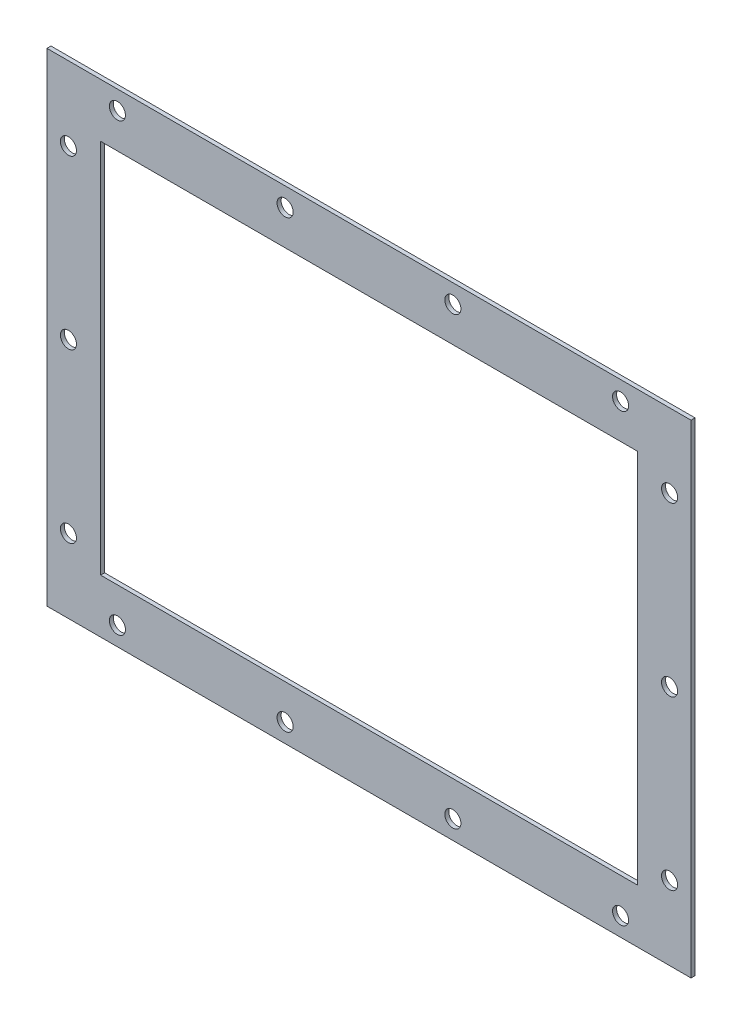
ISO-10303-21;
HEADER;
FILE_DESCRIPTION(('STEP AP214'),'2;1');
FILE_NAME('part.step','',(''),(''),'','','');
FILE_SCHEMA(('AUTOMOTIVE_DESIGN { 1 0 10303 214 1 1 1 1 }'));
ENDSEC;
DATA;
#1=APPLICATION_CONTEXT('core data for automotive mechanical design processes');
#2=APPLICATION_PROTOCOL_DEFINITION('international standard','automotive_design',2000,#1);
#3=PRODUCT_CONTEXT('',#1,'mechanical');
#4=PRODUCT('Part','Part','',(#3));
#5=PRODUCT_RELATED_PRODUCT_CATEGORY('part','',(#4));
#6=PRODUCT_DEFINITION_FORMATION('','',#4);
#7=PRODUCT_DEFINITION_CONTEXT('part definition',#1,'design');
#8=PRODUCT_DEFINITION('design','',#6,#7);
#9=PRODUCT_DEFINITION_SHAPE('','',#8);
#10=(LENGTH_UNIT() NAMED_UNIT(*) SI_UNIT(.MILLI.,.METRE.));
#11=(NAMED_UNIT(*) PLANE_ANGLE_UNIT() SI_UNIT($,.RADIAN.));
#12=(NAMED_UNIT(*) SI_UNIT($,.STERADIAN.) SOLID_ANGLE_UNIT());
#13=UNCERTAINTY_MEASURE_WITH_UNIT(LENGTH_MEASURE(1.E-05),#10,'distance_accuracy_value','');
#14=(GEOMETRIC_REPRESENTATION_CONTEXT(3) GLOBAL_UNCERTAINTY_ASSIGNED_CONTEXT((#13)) GLOBAL_UNIT_ASSIGNED_CONTEXT((#10,
#11,#12)) REPRESENTATION_CONTEXT('',''));
#15=CARTESIAN_POINT('',(0.,0.,0.));
#16=DIRECTION('',(0.,0.,1.));
#17=DIRECTION('',(1.,0.,0.));
#18=AXIS2_PLACEMENT_3D('',#15,#16,#17);
#19=CARTESIAN_POINT('',(-0.00118137540872088,140.003031099028,-299.996268284591));
#20=DIRECTION('',(0.,-1.,0.));
#21=DIRECTION('',(-1.,0.,0.));
#22=AXIS2_PLACEMENT_3D('',#19,#20,#21);
#23=PLANE('',#22);
#24=DIRECTION('',(0.,0.,-1.));
#25=VECTOR('',#24,1.);
#26=CARTESIAN_POINT('',(199.998818624592,140.003031099028,-299.996268284593));
#27=LINE('',#26,#25);
#28=CARTESIAN_POINT('',(199.998818624592,140.003031099028,-296.996268284593));
#29=VERTEX_POINT('',#28);
#30=CARTESIAN_POINT('',(199.998818624592,140.003031099028,-299.996268284593));
#31=VERTEX_POINT('',#30);
#32=EDGE_CURVE('E11',#29,#31,#27,.T.);
#33=ORIENTED_EDGE('',*,*,#32,.F.);
#34=DIRECTION('',(-1.,0.,0.));
#35=VECTOR('',#34,1.);
#36=CARTESIAN_POINT('',(-0.00118137540869924,140.003031099028,-296.996268284591));
#37=LINE('',#36,#35);
#38=CARTESIAN_POINT('',(-200.001181375408,140.003031099029,-296.99626828459));
#39=VERTEX_POINT('',#38);
#40=EDGE_CURVE('E104',#29,#39,#37,.T.);
#41=ORIENTED_EDGE('',*,*,#40,.T.);
#42=DIRECTION('',(0.,0.,-1.));
#43=VECTOR('',#42,1.);
#44=CARTESIAN_POINT('',(-200.001181375408,140.003031099029,-299.996268284591));
#45=LINE('',#44,#43);
#46=CARTESIAN_POINT('',(-200.001181375408,140.003031099029,-299.996268284591));
#47=VERTEX_POINT('',#46);
#48=EDGE_CURVE('E47',#39,#47,#45,.T.);
#49=ORIENTED_EDGE('',*,*,#48,.T.);
#50=DIRECTION('',(-1.,0.,0.));
#51=VECTOR('',#50,1.);
#52=CARTESIAN_POINT('',(-0.00118137540872088,140.003031099028,-299.996268284591));
#53=LINE('',#52,#51);
#54=EDGE_CURVE('E132',#31,#47,#53,.T.);
#55=ORIENTED_EDGE('',*,*,#54,.F.);
#56=EDGE_LOOP('',(#33,#41,#49,#55));
#57=FACE_BOUND('',#56,.T.);
#58=ADVANCED_FACE('F37',(#57),#23,.T.);
#59=CARTESIAN_POINT('',(-200.001181375408,0.00303109902907717,-299.99626828459));
#60=DIRECTION('',(-1.,0.,0.));
#61=DIRECTION('',(0.,1.,0.));
#62=AXIS2_PLACEMENT_3D('',#59,#60,#61);
#63=PLANE('',#62);
#64=ORIENTED_EDGE('',*,*,#48,.F.);
#65=DIRECTION('',(0.,1.,0.));
#66=VECTOR('',#65,1.);
#67=CARTESIAN_POINT('',(-200.001181375408,0.00303109902907974,-296.99626828459));
#68=LINE('',#67,#66);
#69=CARTESIAN_POINT('',(-200.001181375409,-139.99696890097,-296.996268284589));
#70=VERTEX_POINT('',#69);
#71=EDGE_CURVE('E114',#39,#70,#68,.F.);
#72=ORIENTED_EDGE('',*,*,#71,.T.);
#73=DIRECTION('',(0.,0.,-1.));
#74=VECTOR('',#73,1.);
#75=CARTESIAN_POINT('',(-200.00118137541,-139.99696890097,-299.99626828459));
#76=LINE('',#75,#74);
#77=CARTESIAN_POINT('',(-200.00118137541,-139.99696890097,-299.99626828459));
#78=VERTEX_POINT('',#77);
#79=EDGE_CURVE('E55',#70,#78,#76,.T.);
#80=ORIENTED_EDGE('',*,*,#79,.T.);
#81=DIRECTION('',(0.,1.,0.));
#82=VECTOR('',#81,1.);
#83=CARTESIAN_POINT('',(-200.001181375408,0.00303109902907717,-299.99626828459));
#84=LINE('',#83,#82);
#85=EDGE_CURVE('E129',#47,#78,#84,.F.);
#86=ORIENTED_EDGE('',*,*,#85,.F.);
#87=EDGE_LOOP('',(#64,#72,#80,#86));
#88=FACE_BOUND('',#87,.T.);
#89=ADVANCED_FACE('F137',(#88),#63,.F.);
#90=CARTESIAN_POINT('',(-0.00118137540872088,-139.99696890097,-299.996268284591));
#91=DIRECTION('',(0.,-1.,0.));
#92=DIRECTION('',(-1.,0.,0.));
#93=AXIS2_PLACEMENT_3D('',#90,#91,#92);
#94=PLANE('',#93);
#95=ORIENTED_EDGE('',*,*,#79,.F.);
#96=DIRECTION('',(-1.,0.,0.));
#97=VECTOR('',#96,1.);
#98=CARTESIAN_POINT('',(-0.00118137540869924,-139.99696890097,-296.996268284591));
#99=LINE('',#98,#97);
#100=CARTESIAN_POINT('',(199.99881862459,-139.996968900972,-296.996268284592));
#101=VERTEX_POINT('',#100);
#102=EDGE_CURVE('E103',#70,#101,#99,.F.);
#103=ORIENTED_EDGE('',*,*,#102,.T.);
#104=DIRECTION('',(0.,0.,-1.));
#105=VECTOR('',#104,1.);
#106=CARTESIAN_POINT('',(199.99881862459,-139.996968900972,-299.996268284591));
#107=LINE('',#106,#105);
#108=CARTESIAN_POINT('',(199.99881862459,-139.996968900972,-299.996268284591));
#109=VERTEX_POINT('',#108);
#110=EDGE_CURVE('E41',#101,#109,#107,.T.);
#111=ORIENTED_EDGE('',*,*,#110,.T.);
#112=DIRECTION('',(-1.,0.,0.));
#113=VECTOR('',#112,1.);
#114=CARTESIAN_POINT('',(-0.00118137540872088,-139.99696890097,-299.996268284591));
#115=LINE('',#114,#113);
#116=EDGE_CURVE('E305',#78,#109,#115,.F.);
#117=ORIENTED_EDGE('',*,*,#116,.F.);
#118=EDGE_LOOP('',(#95,#103,#111,#117));
#119=FACE_BOUND('',#118,.T.);
#120=ADVANCED_FACE('F106',(#119),#94,.F.);
#121=CARTESIAN_POINT('',(-0.00118137540872088,-179.996968900972,-299.996268284591));
#122=DIRECTION('',(0.,-1.,0.));
#123=DIRECTION('',(-1.,0.,0.));
#124=AXIS2_PLACEMENT_3D('',#121,#122,#123);
#125=PLANE('',#124);
#126=DIRECTION('',(0.,0.,-1.));
#127=VECTOR('',#126,1.);
#128=CARTESIAN_POINT('',(239.99881862459,-179.996968900972,-299.996268284591));
#129=LINE('',#128,#127);
#130=CARTESIAN_POINT('',(239.998818624591,-179.996968900972,-296.996268284593));
#131=VERTEX_POINT('',#130);
#132=CARTESIAN_POINT('',(239.99881862459,-179.996968900972,-299.996268284591));
#133=VERTEX_POINT('',#132);
#134=EDGE_CURVE('E98',#131,#133,#129,.T.);
#135=ORIENTED_EDGE('',*,*,#134,.F.);
#136=DIRECTION('',(-1.,0.,0.));
#137=VECTOR('',#136,1.);
#138=CARTESIAN_POINT('',(-0.00118137540869924,-179.996968900972,-296.996268284591));
#139=LINE('',#138,#137);
#140=CARTESIAN_POINT('',(-240.00118137541,-179.99696890097,-296.996268284589));
#141=VERTEX_POINT('',#140);
#142=EDGE_CURVE('E149',#131,#141,#139,.T.);
#143=ORIENTED_EDGE('',*,*,#142,.T.);
#144=DIRECTION('',(0.,0.,-1.));
#145=VECTOR('',#144,1.);
#146=CARTESIAN_POINT('',(-240.00118137541,-179.99696890097,-299.996268284589));
#147=LINE('',#146,#145);
#148=CARTESIAN_POINT('',(-240.00118137541,-179.99696890097,-299.996268284589));
#149=VERTEX_POINT('',#148);
#150=EDGE_CURVE('E121',#141,#149,#147,.T.);
#151=ORIENTED_EDGE('',*,*,#150,.T.);
#152=DIRECTION('',(-1.,0.,0.));
#153=VECTOR('',#152,1.);
#154=CARTESIAN_POINT('',(-0.00118137540872088,-179.996968900972,-299.996268284591));
#155=LINE('',#154,#153);
#156=EDGE_CURVE('E330',#133,#149,#155,.T.);
#157=ORIENTED_EDGE('',*,*,#156,.F.);
#158=EDGE_LOOP('',(#135,#143,#151,#157));
#159=FACE_BOUND('',#158,.T.);
#160=ADVANCED_FACE('F218',(#159),#125,.T.);
#161=CARTESIAN_POINT('',(-240.00118137541,0.00303109902907717,-299.996268284589));
#162=DIRECTION('',(-1.,0.,0.));
#163=DIRECTION('',(0.,1.,0.));
#164=AXIS2_PLACEMENT_3D('',#161,#162,#163);
#165=PLANE('',#164);
#166=ORIENTED_EDGE('',*,*,#150,.F.);
#167=DIRECTION('',(0.,1.,0.));
#168=VECTOR('',#167,1.);
#169=CARTESIAN_POINT('',(-240.00118137541,0.00303109902907974,-296.996268284589));
#170=LINE('',#169,#168);
#171=CARTESIAN_POINT('',(-240.001181375408,180.00303109903,-296.996268284589));
#172=VERTEX_POINT('',#171);
#173=EDGE_CURVE('E145',#141,#172,#170,.T.);
#174=ORIENTED_EDGE('',*,*,#173,.T.);
#175=DIRECTION('',(0.,0.,-1.));
#176=VECTOR('',#175,1.);
#177=CARTESIAN_POINT('',(-240.001181375408,180.00303109903,-299.996268284591));
#178=LINE('',#177,#176);
#179=CARTESIAN_POINT('',(-240.001181375408,180.00303109903,-299.996268284591));
#180=VERTEX_POINT('',#179);
#181=EDGE_CURVE('E118',#172,#180,#178,.T.);
#182=ORIENTED_EDGE('',*,*,#181,.T.);
#183=DIRECTION('',(0.,1.,0.));
#184=VECTOR('',#183,1.);
#185=CARTESIAN_POINT('',(-240.00118137541,0.00303109902907717,-299.996268284589));
#186=LINE('',#185,#184);
#187=EDGE_CURVE('E328',#149,#180,#186,.T.);
#188=ORIENTED_EDGE('',*,*,#187,.F.);
#189=EDGE_LOOP('',(#166,#174,#182,#188));
#190=FACE_BOUND('',#189,.T.);
#191=ADVANCED_FACE('F222',(#190),#165,.T.);
#192=CARTESIAN_POINT('',(-0.00118137540872088,180.00303109903,-299.996268284591));
#193=DIRECTION('',(0.,-1.,0.));
#194=DIRECTION('',(-1.,0.,0.));
#195=AXIS2_PLACEMENT_3D('',#192,#193,#194);
#196=PLANE('',#195);
#197=ORIENTED_EDGE('',*,*,#181,.F.);
#198=DIRECTION('',(-1.,0.,0.));
#199=VECTOR('',#198,1.);
#200=CARTESIAN_POINT('',(-0.00118137540869924,180.00303109903,-296.996268284591));
#201=LINE('',#200,#199);
#202=CARTESIAN_POINT('',(239.998818624592,180.003031099028,-296.996268284593));
#203=VERTEX_POINT('',#202);
#204=EDGE_CURVE('E141',#172,#203,#201,.F.);
#205=ORIENTED_EDGE('',*,*,#204,.T.);
#206=DIRECTION('',(0.,0.,-1.));
#207=VECTOR('',#206,1.);
#208=CARTESIAN_POINT('',(239.998818624592,180.003031099028,-299.996268284593));
#209=LINE('',#208,#207);
#210=CARTESIAN_POINT('',(239.998818624592,180.003031099028,-299.996268284593));
#211=VERTEX_POINT('',#210);
#212=EDGE_CURVE('E122',#203,#211,#209,.T.);
#213=ORIENTED_EDGE('',*,*,#212,.T.);
#214=DIRECTION('',(-1.,0.,0.));
#215=VECTOR('',#214,1.);
#216=CARTESIAN_POINT('',(-0.00118137540872088,180.00303109903,-299.996268284591));
#217=LINE('',#216,#215);
#218=EDGE_CURVE('E116',#180,#211,#217,.F.);
#219=ORIENTED_EDGE('',*,*,#218,.F.);
#220=EDGE_LOOP('',(#197,#205,#213,#219));
#221=FACE_BOUND('',#220,.T.);
#222=ADVANCED_FACE('F228',(#221),#196,.F.);
#223=CARTESIAN_POINT('',(239.998818624592,0.00303109902907717,-299.996268284593));
#224=DIRECTION('',(-1.,0.,0.));
#225=DIRECTION('',(0.,1.,0.));
#226=AXIS2_PLACEMENT_3D('',#223,#224,#225);
#227=PLANE('',#226);
#228=DIRECTION('',(0.,1.,0.));
#229=VECTOR('',#228,1.);
#230=CARTESIAN_POINT('',(239.998818624592,0.00303109902907974,-296.996268284593));
#231=LINE('',#230,#229);
#232=EDGE_CURVE('E144',#203,#131,#231,.F.);
#233=ORIENTED_EDGE('',*,*,#232,.T.);
#234=ORIENTED_EDGE('',*,*,#134,.T.);
#235=DIRECTION('',(0.,1.,0.));
#236=VECTOR('',#235,1.);
#237=CARTESIAN_POINT('',(239.998818624592,0.00303109902907717,-299.996268284593));
#238=LINE('',#237,#236);
#239=EDGE_CURVE('E325',#211,#133,#238,.F.);
#240=ORIENTED_EDGE('',*,*,#239,.F.);
#241=ORIENTED_EDGE('',*,*,#212,.F.);
#242=EDGE_LOOP('',(#233,#234,#240,#241));
#243=FACE_BOUND('',#242,.T.);
#244=ADVANCED_FACE('F233',(#243),#227,.F.);
#245=CARTESIAN_POINT('',(-224.001181375408,125.00303109903,-299.99626828459));
#246=DIRECTION('',(0.,0.,1.));
#247=DIRECTION('',(1.,0.,0.));
#248=AXIS2_PLACEMENT_3D('',#245,#246,#247);
#249=CYLINDRICAL_SURFACE('',#248,6.);
#250=CARTESIAN_POINT('',(-224.001181375408,125.00303109903,-299.99626828459));
#251=DIRECTION('',(0.,0.,1.));
#252=DIRECTION('',(1.,0.,0.));
#253=AXIS2_PLACEMENT_3D('',#250,#251,#252);
#254=CIRCLE('',#253,6.);
#255=CARTESIAN_POINT('',(-218.001181375408,125.00303109903,-299.99626828459));
#256=VERTEX_POINT('',#255);
#257=EDGE_CURVE('E335',#256,#256,#254,.T.);
#258=ORIENTED_EDGE('',*,*,#257,.F.);
#259=EDGE_LOOP('',(#258));
#260=FACE_BOUND('',#259,.T.);
#261=CARTESIAN_POINT('',(-224.001181375408,125.00303109903,-296.99626828459));
#262=DIRECTION('',(0.,0.,1.));
#263=DIRECTION('',(1.,0.,0.));
#264=AXIS2_PLACEMENT_3D('',#261,#262,#263);
#265=CIRCLE('',#264,6.);
#266=CARTESIAN_POINT('',(-218.001181375408,125.00303109903,-296.99626828459));
#267=VERTEX_POINT('',#266);
#268=EDGE_CURVE('E148',#267,#267,#265,.T.);
#269=ORIENTED_EDGE('',*,*,#268,.T.);
#270=EDGE_LOOP('',(#269));
#271=FACE_BOUND('',#270,.T.);
#272=ADVANCED_FACE('F236',(#260,#271),#249,.F.);
#273=CARTESIAN_POINT('',(-224.001181375409,0.00303109903036424,-299.99626828459));
#274=DIRECTION('',(0.,0.,1.));
#275=DIRECTION('',(1.,0.,0.));
#276=AXIS2_PLACEMENT_3D('',#273,#274,#275);
#277=CYLINDRICAL_SURFACE('',#276,6.);
#278=CARTESIAN_POINT('',(-224.001181375409,0.00303109903036424,-299.99626828459));
#279=DIRECTION('',(0.,0.,1.));
#280=DIRECTION('',(1.,0.,0.));
#281=AXIS2_PLACEMENT_3D('',#278,#279,#280);
#282=CIRCLE('',#281,6.);
#283=CARTESIAN_POINT('',(-218.001181375409,0.00303109903036424,-299.99626828459));
#284=VERTEX_POINT('',#283);
#285=EDGE_CURVE('E338',#284,#284,#282,.T.);
#286=ORIENTED_EDGE('',*,*,#285,.F.);
#287=EDGE_LOOP('',(#286));
#288=FACE_BOUND('',#287,.T.);
#289=CARTESIAN_POINT('',(-224.001181375409,0.00303109903036681,-296.99626828459));
#290=DIRECTION('',(0.,0.,1.));
#291=DIRECTION('',(1.,0.,0.));
#292=AXIS2_PLACEMENT_3D('',#289,#290,#291);
#293=CIRCLE('',#292,6.);
#294=CARTESIAN_POINT('',(-218.001181375409,0.00303109903036681,-296.99626828459));
#295=VERTEX_POINT('',#294);
#296=EDGE_CURVE('E156',#295,#295,#293,.T.);
#297=ORIENTED_EDGE('',*,*,#296,.T.);
#298=EDGE_LOOP('',(#297));
#299=FACE_BOUND('',#298,.T.);
#300=ADVANCED_FACE('F240',(#288,#299),#277,.F.);
#301=CARTESIAN_POINT('',(-224.00118137541,-124.996968900969,-299.99626828459));
#302=DIRECTION('',(0.,0.,1.));
#303=DIRECTION('',(1.,0.,0.));
#304=AXIS2_PLACEMENT_3D('',#301,#302,#303);
#305=CYLINDRICAL_SURFACE('',#304,6.);
#306=CARTESIAN_POINT('',(-224.00118137541,-124.996968900969,-299.99626828459));
#307=DIRECTION('',(0.,0.,1.));
#308=DIRECTION('',(1.,0.,0.));
#309=AXIS2_PLACEMENT_3D('',#306,#307,#308);
#310=CIRCLE('',#309,6.);
#311=CARTESIAN_POINT('',(-218.00118137541,-124.996968900969,-299.99626828459));
#312=VERTEX_POINT('',#311);
#313=EDGE_CURVE('E341',#312,#312,#310,.T.);
#314=ORIENTED_EDGE('',*,*,#313,.F.);
#315=EDGE_LOOP('',(#314));
#316=FACE_BOUND('',#315,.T.);
#317=CARTESIAN_POINT('',(-224.00118137541,-124.996968900969,-296.99626828459));
#318=DIRECTION('',(0.,0.,1.));
#319=DIRECTION('',(1.,0.,0.));
#320=AXIS2_PLACEMENT_3D('',#317,#318,#319);
#321=CIRCLE('',#320,6.);
#322=CARTESIAN_POINT('',(-218.00118137541,-124.996968900969,-296.99626828459));
#323=VERTEX_POINT('',#322);
#324=EDGE_CURVE('E159',#323,#323,#321,.T.);
#325=ORIENTED_EDGE('',*,*,#324,.T.);
#326=EDGE_LOOP('',(#325));
#327=FACE_BOUND('',#326,.T.);
#328=ADVANCED_FACE('F244',(#316,#327),#305,.F.);
#329=CARTESIAN_POINT('',(223.998818624591,0.00303109902781073,-299.996268284593));
#330=DIRECTION('',(0.,0.,1.));
#331=DIRECTION('',(1.,0.,0.));
#332=AXIS2_PLACEMENT_3D('',#329,#330,#331);
#333=CYLINDRICAL_SURFACE('',#332,6.);
#334=CARTESIAN_POINT('',(223.998818624591,0.00303109902781073,-299.996268284593));
#335=DIRECTION('',(0.,0.,1.));
#336=DIRECTION('',(1.,0.,0.));
#337=AXIS2_PLACEMENT_3D('',#334,#335,#336);
#338=CIRCLE('',#337,6.);
#339=CARTESIAN_POINT('',(229.998818624591,0.00303109902781073,-299.996268284593));
#340=VERTEX_POINT('',#339);
#341=EDGE_CURVE('E344',#340,#340,#338,.T.);
#342=ORIENTED_EDGE('',*,*,#341,.F.);
#343=EDGE_LOOP('',(#342));
#344=FACE_BOUND('',#343,.T.);
#345=CARTESIAN_POINT('',(223.998818624591,0.0030310990278133,-296.996268284593));
#346=DIRECTION('',(0.,0.,1.));
#347=DIRECTION('',(1.,0.,0.));
#348=AXIS2_PLACEMENT_3D('',#345,#346,#347);
#349=CIRCLE('',#348,6.);
#350=CARTESIAN_POINT('',(229.998818624591,0.0030310990278133,-296.996268284593));
#351=VERTEX_POINT('',#350);
#352=EDGE_CURVE('E162',#351,#351,#349,.T.);
#353=ORIENTED_EDGE('',*,*,#352,.T.);
#354=EDGE_LOOP('',(#353));
#355=FACE_BOUND('',#354,.T.);
#356=ADVANCED_FACE('F248',(#344,#355),#333,.F.);
#357=CARTESIAN_POINT('',(223.99881862459,-124.996968900972,-299.996268284593));
#358=DIRECTION('',(0.,0.,1.));
#359=DIRECTION('',(1.,0.,0.));
#360=AXIS2_PLACEMENT_3D('',#357,#358,#359);
#361=CYLINDRICAL_SURFACE('',#360,6.);
#362=CARTESIAN_POINT('',(223.99881862459,-124.996968900972,-299.996268284593));
#363=DIRECTION('',(0.,0.,1.));
#364=DIRECTION('',(1.,0.,0.));
#365=AXIS2_PLACEMENT_3D('',#362,#363,#364);
#366=CIRCLE('',#365,6.);
#367=CARTESIAN_POINT('',(229.99881862459,-124.996968900972,-299.996268284593));
#368=VERTEX_POINT('',#367);
#369=EDGE_CURVE('E347',#368,#368,#366,.T.);
#370=ORIENTED_EDGE('',*,*,#369,.F.);
#371=EDGE_LOOP('',(#370));
#372=FACE_BOUND('',#371,.T.);
#373=CARTESIAN_POINT('',(223.99881862459,-124.996968900972,-296.996268284593));
#374=DIRECTION('',(0.,0.,1.));
#375=DIRECTION('',(1.,0.,0.));
#376=AXIS2_PLACEMENT_3D('',#373,#374,#375);
#377=CIRCLE('',#376,6.);
#378=CARTESIAN_POINT('',(229.99881862459,-124.996968900972,-296.996268284593));
#379=VERTEX_POINT('',#378);
#380=EDGE_CURVE('E165',#379,#379,#377,.T.);
#381=ORIENTED_EDGE('',*,*,#380,.T.);
#382=EDGE_LOOP('',(#381));
#383=FACE_BOUND('',#382,.T.);
#384=ADVANCED_FACE('F252',(#372,#383),#361,.F.);
#385=CARTESIAN_POINT('',(62.4988186245921,166.003031099029,-299.996268284592));
#386=DIRECTION('',(0.,0.,1.));
#387=DIRECTION('',(1.,0.,0.));
#388=AXIS2_PLACEMENT_3D('',#385,#386,#387);
#389=CYLINDRICAL_SURFACE('',#388,6.);
#390=CARTESIAN_POINT('',(62.4988186245921,166.003031099029,-299.996268284592));
#391=DIRECTION('',(0.,0.,1.));
#392=DIRECTION('',(1.,0.,0.));
#393=AXIS2_PLACEMENT_3D('',#390,#391,#392);
#394=CIRCLE('',#393,6.);
#395=CARTESIAN_POINT('',(68.4988186245921,166.003031099029,-299.996268284592));
#396=VERTEX_POINT('',#395);
#397=EDGE_CURVE('E350',#396,#396,#394,.T.);
#398=ORIENTED_EDGE('',*,*,#397,.F.);
#399=EDGE_LOOP('',(#398));
#400=FACE_BOUND('',#399,.T.);
#401=CARTESIAN_POINT('',(62.4988186245921,166.003031099029,-296.996268284592));
#402=DIRECTION('',(0.,0.,1.));
#403=DIRECTION('',(1.,0.,0.));
#404=AXIS2_PLACEMENT_3D('',#401,#402,#403);
#405=CIRCLE('',#404,6.);
#406=CARTESIAN_POINT('',(68.4988186245921,166.003031099029,-296.996268284592));
#407=VERTEX_POINT('',#406);
#408=EDGE_CURVE('E168',#407,#407,#405,.T.);
#409=ORIENTED_EDGE('',*,*,#408,.T.);
#410=EDGE_LOOP('',(#409));
#411=FACE_BOUND('',#410,.T.);
#412=ADVANCED_FACE('F256',(#400,#411),#389,.F.);
#413=CARTESIAN_POINT('',(187.498818624592,166.003031099029,-299.996268284593));
#414=DIRECTION('',(0.,0.,1.));
#415=DIRECTION('',(1.,0.,0.));
#416=AXIS2_PLACEMENT_3D('',#413,#414,#415);
#417=CYLINDRICAL_SURFACE('',#416,6.);
#418=CARTESIAN_POINT('',(187.498818624592,166.003031099029,-299.996268284593));
#419=DIRECTION('',(0.,0.,1.));
#420=DIRECTION('',(1.,0.,0.));
#421=AXIS2_PLACEMENT_3D('',#418,#419,#420);
#422=CIRCLE('',#421,6.);
#423=CARTESIAN_POINT('',(193.498818624592,166.003031099029,-299.996268284593));
#424=VERTEX_POINT('',#423);
#425=EDGE_CURVE('E353',#424,#424,#422,.T.);
#426=ORIENTED_EDGE('',*,*,#425,.F.);
#427=EDGE_LOOP('',(#426));
#428=FACE_BOUND('',#427,.T.);
#429=CARTESIAN_POINT('',(187.498818624592,166.003031099029,-296.996268284593));
#430=DIRECTION('',(0.,0.,1.));
#431=DIRECTION('',(1.,0.,0.));
#432=AXIS2_PLACEMENT_3D('',#429,#430,#431);
#433=CIRCLE('',#432,6.);
#434=CARTESIAN_POINT('',(193.498818624592,166.003031099029,-296.996268284593));
#435=VERTEX_POINT('',#434);
#436=EDGE_CURVE('E171',#435,#435,#433,.T.);
#437=ORIENTED_EDGE('',*,*,#436,.T.);
#438=EDGE_LOOP('',(#437));
#439=FACE_BOUND('',#438,.T.);
#440=ADVANCED_FACE('F260',(#428,#439),#417,.F.);
#441=CARTESIAN_POINT('',(-187.501181375408,166.00303109903,-299.99626828459));
#442=DIRECTION('',(0.,0.,1.));
#443=DIRECTION('',(1.,0.,0.));
#444=AXIS2_PLACEMENT_3D('',#441,#442,#443);
#445=CYLINDRICAL_SURFACE('',#444,6.);
#446=CARTESIAN_POINT('',(-187.501181375408,166.00303109903,-299.99626828459));
#447=DIRECTION('',(0.,0.,1.));
#448=DIRECTION('',(1.,0.,0.));
#449=AXIS2_PLACEMENT_3D('',#446,#447,#448);
#450=CIRCLE('',#449,6.);
#451=CARTESIAN_POINT('',(-181.501181375408,166.00303109903,-299.99626828459));
#452=VERTEX_POINT('',#451);
#453=EDGE_CURVE('E356',#452,#452,#450,.T.);
#454=ORIENTED_EDGE('',*,*,#453,.F.);
#455=EDGE_LOOP('',(#454));
#456=FACE_BOUND('',#455,.T.);
#457=CARTESIAN_POINT('',(-187.501181375408,166.00303109903,-296.99626828459));
#458=DIRECTION('',(0.,0.,1.));
#459=DIRECTION('',(1.,0.,0.));
#460=AXIS2_PLACEMENT_3D('',#457,#458,#459);
#461=CIRCLE('',#460,6.);
#462=CARTESIAN_POINT('',(-181.501181375408,166.00303109903,-296.99626828459));
#463=VERTEX_POINT('',#462);
#464=EDGE_CURVE('E174',#463,#463,#461,.T.);
#465=ORIENTED_EDGE('',*,*,#464,.T.);
#466=EDGE_LOOP('',(#465));
#467=FACE_BOUND('',#466,.T.);
#468=ADVANCED_FACE('F264',(#456,#467),#445,.F.);
#469=CARTESIAN_POINT('',(223.998818624592,125.003031099027,-299.996268284593));
#470=DIRECTION('',(0.,0.,1.));
#471=DIRECTION('',(1.,0.,0.));
#472=AXIS2_PLACEMENT_3D('',#469,#470,#471);
#473=CYLINDRICAL_SURFACE('',#472,6.);
#474=CARTESIAN_POINT('',(223.998818624592,125.003031099027,-299.996268284593));
#475=DIRECTION('',(0.,0.,1.));
#476=DIRECTION('',(1.,0.,0.));
#477=AXIS2_PLACEMENT_3D('',#474,#475,#476);
#478=CIRCLE('',#477,6.);
#479=CARTESIAN_POINT('',(229.998818624592,125.003031099027,-299.996268284593));
#480=VERTEX_POINT('',#479);
#481=EDGE_CURVE('E359',#480,#480,#478,.T.);
#482=ORIENTED_EDGE('',*,*,#481,.F.);
#483=EDGE_LOOP('',(#482));
#484=FACE_BOUND('',#483,.T.);
#485=CARTESIAN_POINT('',(223.998818624592,125.003031099027,-296.996268284593));
#486=DIRECTION('',(0.,0.,1.));
#487=DIRECTION('',(1.,0.,0.));
#488=AXIS2_PLACEMENT_3D('',#485,#486,#487);
#489=CIRCLE('',#488,6.);
#490=CARTESIAN_POINT('',(229.998818624592,125.003031099027,-296.996268284593));
#491=VERTEX_POINT('',#490);
#492=EDGE_CURVE('E177',#491,#491,#489,.T.);
#493=ORIENTED_EDGE('',*,*,#492,.T.);
#494=EDGE_LOOP('',(#493));
#495=FACE_BOUND('',#494,.T.);
#496=ADVANCED_FACE('F268',(#484,#495),#473,.F.);
#497=CARTESIAN_POINT('',(-62.5011813754078,166.003031099029,-299.996268284591));
#498=DIRECTION('',(0.,0.,1.));
#499=DIRECTION('',(1.,0.,0.));
#500=AXIS2_PLACEMENT_3D('',#497,#498,#499);
#501=CYLINDRICAL_SURFACE('',#500,6.);
#502=CARTESIAN_POINT('',(-62.5011813754078,166.003031099029,-299.996268284591));
#503=DIRECTION('',(0.,0.,1.));
#504=DIRECTION('',(1.,0.,0.));
#505=AXIS2_PLACEMENT_3D('',#502,#503,#504);
#506=CIRCLE('',#505,6.);
#507=CARTESIAN_POINT('',(-56.5011813754078,166.003031099029,-299.996268284591));
#508=VERTEX_POINT('',#507);
#509=EDGE_CURVE('E299',#508,#508,#506,.T.);
#510=ORIENTED_EDGE('',*,*,#509,.F.);
#511=EDGE_LOOP('',(#510));
#512=FACE_BOUND('',#511,.T.);
#513=CARTESIAN_POINT('',(-62.5011813754078,166.003031099029,-296.996268284591));
#514=DIRECTION('',(0.,0.,1.));
#515=DIRECTION('',(1.,0.,0.));
#516=AXIS2_PLACEMENT_3D('',#513,#514,#515);
#517=CIRCLE('',#516,6.);
#518=CARTESIAN_POINT('',(-56.5011813754078,166.003031099029,-296.996268284591));
#519=VERTEX_POINT('',#518);
#520=EDGE_CURVE('E180',#519,#519,#517,.T.);
#521=ORIENTED_EDGE('',*,*,#520,.T.);
#522=EDGE_LOOP('',(#521));
#523=FACE_BOUND('',#522,.T.);
#524=ADVANCED_FACE('F272',(#512,#523),#501,.F.);
#525=CARTESIAN_POINT('',(-62.5011813754097,-165.996968900971,-299.996268284591));
#526=DIRECTION('',(0.,0.,1.));
#527=DIRECTION('',(1.,0.,0.));
#528=AXIS2_PLACEMENT_3D('',#525,#526,#527);
#529=CYLINDRICAL_SURFACE('',#528,6.);
#530=CARTESIAN_POINT('',(-62.5011813754097,-165.996968900971,-299.996268284591));
#531=DIRECTION('',(0.,0.,1.));
#532=DIRECTION('',(1.,0.,0.));
#533=AXIS2_PLACEMENT_3D('',#530,#531,#532);
#534=CIRCLE('',#533,6.);
#535=CARTESIAN_POINT('',(-56.5011813754097,-165.996968900971,-299.996268284591));
#536=VERTEX_POINT('',#535);
#537=EDGE_CURVE('E293',#536,#536,#534,.T.);
#538=ORIENTED_EDGE('',*,*,#537,.F.);
#539=EDGE_LOOP('',(#538));
#540=FACE_BOUND('',#539,.T.);
#541=CARTESIAN_POINT('',(-62.5011813754097,-165.996968900971,-296.996268284591));
#542=DIRECTION('',(0.,0.,1.));
#543=DIRECTION('',(1.,0.,0.));
#544=AXIS2_PLACEMENT_3D('',#541,#542,#543);
#545=CIRCLE('',#544,6.);
#546=CARTESIAN_POINT('',(-56.5011813754097,-165.996968900971,-296.996268284591));
#547=VERTEX_POINT('',#546);
#548=EDGE_CURVE('E183',#547,#547,#545,.T.);
#549=ORIENTED_EDGE('',*,*,#548,.T.);
#550=EDGE_LOOP('',(#549));
#551=FACE_BOUND('',#550,.T.);
#552=ADVANCED_FACE('F276',(#540,#551),#529,.F.);
#553=CARTESIAN_POINT('',(62.4988186245903,-165.996968900972,-299.996268284592));
#554=DIRECTION('',(0.,0.,1.));
#555=DIRECTION('',(1.,0.,0.));
#556=AXIS2_PLACEMENT_3D('',#553,#554,#555);
#557=CYLINDRICAL_SURFACE('',#556,6.);
#558=CARTESIAN_POINT('',(62.4988186245903,-165.996968900972,-299.996268284592));
#559=DIRECTION('',(0.,0.,1.));
#560=DIRECTION('',(1.,0.,0.));
#561=AXIS2_PLACEMENT_3D('',#558,#559,#560);
#562=CIRCLE('',#561,6.);
#563=CARTESIAN_POINT('',(68.4988186245903,-165.996968900972,-299.996268284592));
#564=VERTEX_POINT('',#563);
#565=EDGE_CURVE('E288',#564,#564,#562,.T.);
#566=ORIENTED_EDGE('',*,*,#565,.F.);
#567=EDGE_LOOP('',(#566));
#568=FACE_BOUND('',#567,.T.);
#569=CARTESIAN_POINT('',(62.4988186245903,-165.996968900972,-296.996268284592));
#570=DIRECTION('',(0.,0.,1.));
#571=DIRECTION('',(1.,0.,0.));
#572=AXIS2_PLACEMENT_3D('',#569,#570,#571);
#573=CIRCLE('',#572,6.);
#574=CARTESIAN_POINT('',(68.4988186245903,-165.996968900972,-296.996268284592));
#575=VERTEX_POINT('',#574);
#576=EDGE_CURVE('E186',#575,#575,#573,.T.);
#577=ORIENTED_EDGE('',*,*,#576,.T.);
#578=EDGE_LOOP('',(#577));
#579=FACE_BOUND('',#578,.T.);
#580=ADVANCED_FACE('F207',(#568,#579),#557,.F.);
#581=CARTESIAN_POINT('',(187.49881862459,-165.996968900972,-299.996268284593));
#582=DIRECTION('',(0.,0.,1.));
#583=DIRECTION('',(1.,0.,0.));
#584=AXIS2_PLACEMENT_3D('',#581,#582,#583);
#585=CYLINDRICAL_SURFACE('',#584,6.);
#586=CARTESIAN_POINT('',(187.49881862459,-165.996968900972,-299.996268284593));
#587=DIRECTION('',(0.,0.,1.));
#588=DIRECTION('',(1.,0.,0.));
#589=AXIS2_PLACEMENT_3D('',#586,#587,#588);
#590=CIRCLE('',#589,6.);
#591=CARTESIAN_POINT('',(193.49881862459,-165.996968900972,-299.996268284593));
#592=VERTEX_POINT('',#591);
#593=EDGE_CURVE('E292',#592,#592,#590,.T.);
#594=ORIENTED_EDGE('',*,*,#593,.F.);
#595=EDGE_LOOP('',(#594));
#596=FACE_BOUND('',#595,.T.);
#597=CARTESIAN_POINT('',(187.49881862459,-165.996968900972,-296.996268284593));
#598=DIRECTION('',(0.,0.,1.));
#599=DIRECTION('',(1.,0.,0.));
#600=AXIS2_PLACEMENT_3D('',#597,#598,#599);
#601=CIRCLE('',#600,6.);
#602=CARTESIAN_POINT('',(193.49881862459,-165.996968900972,-296.996268284593));
#603=VERTEX_POINT('',#602);
#604=EDGE_CURVE('E110',#603,#603,#601,.T.);
#605=ORIENTED_EDGE('',*,*,#604,.T.);
#606=EDGE_LOOP('',(#605));
#607=FACE_BOUND('',#606,.T.);
#608=ADVANCED_FACE('F191',(#596,#607),#585,.F.);
#609=CARTESIAN_POINT('',(-187.50118137541,-165.996968900969,-299.99626828459));
#610=DIRECTION('',(0.,0.,1.));
#611=DIRECTION('',(1.,0.,0.));
#612=AXIS2_PLACEMENT_3D('',#609,#610,#611);
#613=CYLINDRICAL_SURFACE('',#612,6.);
#614=CARTESIAN_POINT('',(-187.50118137541,-165.996968900969,-299.99626828459));
#615=DIRECTION('',(0.,0.,1.));
#616=DIRECTION('',(1.,0.,0.));
#617=AXIS2_PLACEMENT_3D('',#614,#615,#616);
#618=CIRCLE('',#617,6.);
#619=CARTESIAN_POINT('',(-181.50118137541,-165.996968900969,-299.99626828459));
#620=VERTEX_POINT('',#619);
#621=EDGE_CURVE('E296',#620,#620,#618,.T.);
#622=ORIENTED_EDGE('',*,*,#621,.F.);
#623=EDGE_LOOP('',(#622));
#624=FACE_BOUND('',#623,.T.);
#625=CARTESIAN_POINT('',(-187.50118137541,-165.996968900969,-296.99626828459));
#626=DIRECTION('',(0.,0.,1.));
#627=DIRECTION('',(1.,0.,0.));
#628=AXIS2_PLACEMENT_3D('',#625,#626,#627);
#629=CIRCLE('',#628,6.);
#630=CARTESIAN_POINT('',(-181.50118137541,-165.996968900969,-296.99626828459));
#631=VERTEX_POINT('',#630);
#632=EDGE_CURVE('E107',#631,#631,#629,.T.);
#633=ORIENTED_EDGE('',*,*,#632,.T.);
#634=EDGE_LOOP('',(#633));
#635=FACE_BOUND('',#634,.T.);
#636=ADVANCED_FACE('F199',(#624,#635),#613,.F.);
#637=CARTESIAN_POINT('',(199.99881862459,0.00303109902907717,-299.996268284592));
#638=DIRECTION('',(-1.,0.,0.));
#639=DIRECTION('',(0.,1.,0.));
#640=AXIS2_PLACEMENT_3D('',#637,#638,#639);
#641=PLANE('',#640);
#642=DIRECTION('',(0.,1.,0.));
#643=VECTOR('',#642,1.);
#644=CARTESIAN_POINT('',(199.99881862459,0.00303109902907974,-296.996268284592));
#645=LINE('',#644,#643);
#646=EDGE_CURVE('E91',#101,#29,#645,.T.);
#647=ORIENTED_EDGE('',*,*,#646,.T.);
#648=ORIENTED_EDGE('',*,*,#32,.T.);
#649=DIRECTION('',(0.,1.,0.));
#650=VECTOR('',#649,1.);
#651=CARTESIAN_POINT('',(199.99881862459,0.00303109902907717,-299.996268284592));
#652=LINE('',#651,#650);
#653=EDGE_CURVE('E94',#109,#31,#652,.T.);
#654=ORIENTED_EDGE('',*,*,#653,.F.);
#655=ORIENTED_EDGE('',*,*,#110,.F.);
#656=EDGE_LOOP('',(#647,#648,#654,#655));
#657=FACE_BOUND('',#656,.T.);
#658=ADVANCED_FACE('F39',(#657),#641,.T.);
#659=CARTESIAN_POINT('',(-0.00118137540872088,0.00303109902907717,-299.996268284591));
#660=DIRECTION('',(0.,0.,-1.));
#661=DIRECTION('',(-1.,0.,0.));
#662=AXIS2_PLACEMENT_3D('',#659,#660,#661);
#663=PLANE('',#662);
#664=ORIENTED_EDGE('',*,*,#218,.T.);
#665=ORIENTED_EDGE('',*,*,#239,.T.);
#666=ORIENTED_EDGE('',*,*,#156,.T.);
#667=ORIENTED_EDGE('',*,*,#187,.T.);
#668=EDGE_LOOP('',(#664,#665,#666,#667));
#669=FACE_BOUND('',#668,.T.);
#670=ORIENTED_EDGE('',*,*,#257,.T.);
#671=EDGE_LOOP('',(#670));
#672=FACE_BOUND('',#671,.T.);
#673=ORIENTED_EDGE('',*,*,#285,.T.);
#674=EDGE_LOOP('',(#673));
#675=FACE_BOUND('',#674,.T.);
#676=ORIENTED_EDGE('',*,*,#313,.T.);
#677=EDGE_LOOP('',(#676));
#678=FACE_BOUND('',#677,.T.);
#679=ORIENTED_EDGE('',*,*,#341,.T.);
#680=EDGE_LOOP('',(#679));
#681=FACE_BOUND('',#680,.T.);
#682=ORIENTED_EDGE('',*,*,#369,.T.);
#683=EDGE_LOOP('',(#682));
#684=FACE_BOUND('',#683,.T.);
#685=ORIENTED_EDGE('',*,*,#397,.T.);
#686=EDGE_LOOP('',(#685));
#687=FACE_BOUND('',#686,.T.);
#688=ORIENTED_EDGE('',*,*,#425,.T.);
#689=EDGE_LOOP('',(#688));
#690=FACE_BOUND('',#689,.T.);
#691=ORIENTED_EDGE('',*,*,#453,.T.);
#692=EDGE_LOOP('',(#691));
#693=FACE_BOUND('',#692,.T.);
#694=ORIENTED_EDGE('',*,*,#481,.T.);
#695=EDGE_LOOP('',(#694));
#696=FACE_BOUND('',#695,.T.);
#697=ORIENTED_EDGE('',*,*,#509,.T.);
#698=EDGE_LOOP('',(#697));
#699=FACE_BOUND('',#698,.T.);
#700=ORIENTED_EDGE('',*,*,#537,.T.);
#701=EDGE_LOOP('',(#700));
#702=FACE_BOUND('',#701,.T.);
#703=ORIENTED_EDGE('',*,*,#565,.T.);
#704=EDGE_LOOP('',(#703));
#705=FACE_BOUND('',#704,.T.);
#706=ORIENTED_EDGE('',*,*,#593,.T.);
#707=EDGE_LOOP('',(#706));
#708=FACE_BOUND('',#707,.T.);
#709=ORIENTED_EDGE('',*,*,#621,.T.);
#710=EDGE_LOOP('',(#709));
#711=FACE_BOUND('',#710,.T.);
#712=ORIENTED_EDGE('',*,*,#116,.T.);
#713=ORIENTED_EDGE('',*,*,#653,.T.);
#714=ORIENTED_EDGE('',*,*,#54,.T.);
#715=ORIENTED_EDGE('',*,*,#85,.T.);
#716=EDGE_LOOP('',(#712,#713,#714,#715));
#717=FACE_BOUND('',#716,.T.);
#718=ADVANCED_FACE('F135',(#669,#672,#675,#678,#681,#684,#687,#690,#693,#696,#699,#702,#705,
#708,#711,#717),#663,.T.);
#719=CARTESIAN_POINT('',(-0.00118137540869924,0.00303109902907974,-296.996268284591));
#720=DIRECTION('',(0.,0.,-1.));
#721=DIRECTION('',(-1.,0.,0.));
#722=AXIS2_PLACEMENT_3D('',#719,#720,#721);
#723=PLANE('',#722);
#724=ORIENTED_EDGE('',*,*,#204,.F.);
#725=ORIENTED_EDGE('',*,*,#173,.F.);
#726=ORIENTED_EDGE('',*,*,#142,.F.);
#727=ORIENTED_EDGE('',*,*,#232,.F.);
#728=EDGE_LOOP('',(#724,#725,#726,#727));
#729=FACE_BOUND('',#728,.T.);
#730=ORIENTED_EDGE('',*,*,#268,.F.);
#731=EDGE_LOOP('',(#730));
#732=FACE_BOUND('',#731,.T.);
#733=ORIENTED_EDGE('',*,*,#296,.F.);
#734=EDGE_LOOP('',(#733));
#735=FACE_BOUND('',#734,.T.);
#736=ORIENTED_EDGE('',*,*,#324,.F.);
#737=EDGE_LOOP('',(#736));
#738=FACE_BOUND('',#737,.T.);
#739=ORIENTED_EDGE('',*,*,#352,.F.);
#740=EDGE_LOOP('',(#739));
#741=FACE_BOUND('',#740,.T.);
#742=ORIENTED_EDGE('',*,*,#380,.F.);
#743=EDGE_LOOP('',(#742));
#744=FACE_BOUND('',#743,.T.);
#745=ORIENTED_EDGE('',*,*,#408,.F.);
#746=EDGE_LOOP('',(#745));
#747=FACE_BOUND('',#746,.T.);
#748=ORIENTED_EDGE('',*,*,#436,.F.);
#749=EDGE_LOOP('',(#748));
#750=FACE_BOUND('',#749,.T.);
#751=ORIENTED_EDGE('',*,*,#464,.F.);
#752=EDGE_LOOP('',(#751));
#753=FACE_BOUND('',#752,.T.);
#754=ORIENTED_EDGE('',*,*,#492,.F.);
#755=EDGE_LOOP('',(#754));
#756=FACE_BOUND('',#755,.T.);
#757=ORIENTED_EDGE('',*,*,#520,.F.);
#758=EDGE_LOOP('',(#757));
#759=FACE_BOUND('',#758,.T.);
#760=ORIENTED_EDGE('',*,*,#548,.F.);
#761=EDGE_LOOP('',(#760));
#762=FACE_BOUND('',#761,.T.);
#763=ORIENTED_EDGE('',*,*,#576,.F.);
#764=EDGE_LOOP('',(#763));
#765=FACE_BOUND('',#764,.T.);
#766=ORIENTED_EDGE('',*,*,#604,.F.);
#767=EDGE_LOOP('',(#766));
#768=FACE_BOUND('',#767,.T.);
#769=ORIENTED_EDGE('',*,*,#632,.F.);
#770=EDGE_LOOP('',(#769));
#771=FACE_BOUND('',#770,.T.);
#772=ORIENTED_EDGE('',*,*,#102,.F.);
#773=ORIENTED_EDGE('',*,*,#71,.F.);
#774=ORIENTED_EDGE('',*,*,#40,.F.);
#775=ORIENTED_EDGE('',*,*,#646,.F.);
#776=EDGE_LOOP('',(#772,#773,#774,#775));
#777=FACE_BOUND('',#776,.T.);
#778=ADVANCED_FACE('F101',(#729,#732,#735,#738,#741,#744,#747,#750,#753,#756,#759,#762,#765,
#768,#771,#777),#723,.F.);
#779=CLOSED_SHELL('',(#58,#89,#120,#160,#191,#222,#244,#272,#300,#328,#356,#384,#412,#440,#468,
#496,#524,#552,#580,#608,#636,#658,#718,#778));
#780=MANIFOLD_SOLID_BREP('B2',#779);
#781=ADVANCED_BREP_SHAPE_REPRESENTATION('',(#18,#780),#14);
#782=SHAPE_DEFINITION_REPRESENTATION(#9,#781);
ENDSEC;
END-ISO-10303-21;
